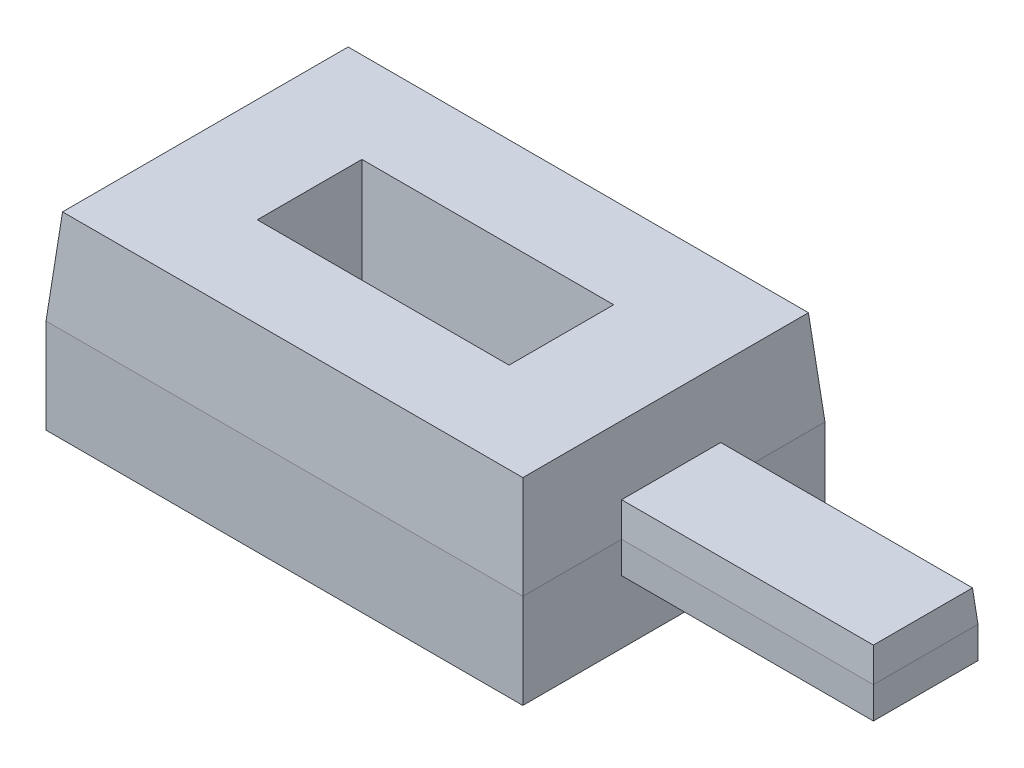
ISO-10303-21;
HEADER;
FILE_DESCRIPTION(('STEP AP214'),'2;1');
FILE_NAME('part.step','',(''),(''),'','','');
FILE_SCHEMA(('AUTOMOTIVE_DESIGN { 1 0 10303 214 1 1 1 1 }'));
ENDSEC;
DATA;
#1=APPLICATION_CONTEXT('core data for automotive mechanical design processes');
#2=APPLICATION_PROTOCOL_DEFINITION('international standard','automotive_design',2000,#1);
#3=PRODUCT_CONTEXT('',#1,'mechanical');
#4=PRODUCT('Part','Part','',(#3));
#5=PRODUCT_RELATED_PRODUCT_CATEGORY('part','',(#4));
#6=PRODUCT_DEFINITION_FORMATION('','',#4);
#7=PRODUCT_DEFINITION_CONTEXT('part definition',#1,'design');
#8=PRODUCT_DEFINITION('design','',#6,#7);
#9=PRODUCT_DEFINITION_SHAPE('','',#8);
#10=(LENGTH_UNIT() NAMED_UNIT(*) SI_UNIT(.MILLI.,.METRE.));
#11=(NAMED_UNIT(*) PLANE_ANGLE_UNIT() SI_UNIT($,.RADIAN.));
#12=(NAMED_UNIT(*) SI_UNIT($,.STERADIAN.) SOLID_ANGLE_UNIT());
#13=UNCERTAINTY_MEASURE_WITH_UNIT(LENGTH_MEASURE(1.E-05),#10,'distance_accuracy_value','');
#14=(GEOMETRIC_REPRESENTATION_CONTEXT(3) GLOBAL_UNCERTAINTY_ASSIGNED_CONTEXT((#13)) GLOBAL_UNIT_ASSIGNED_CONTEXT((#10,
#11,#12)) REPRESENTATION_CONTEXT('',''));
#15=CARTESIAN_POINT('',(0.,0.,0.));
#16=DIRECTION('',(0.,0.,1.));
#17=DIRECTION('',(1.,0.,0.));
#18=AXIS2_PLACEMENT_3D('',#15,#16,#17);
#19=CARTESIAN_POINT('',(75.6578707325463,30.,47.9373382314693));
#20=DIRECTION('',(0.,0.,1.));
#21=DIRECTION('',(1.,0.,0.));
#22=AXIS2_PLACEMENT_3D('',#19,#20,#21);
#23=PLANE('',#22);
#24=DIRECTION('',(0.,-1.,0.));
#25=VECTOR('',#24,1.);
#26=CARTESIAN_POINT('',(75.6578707325463,30.,47.9373382314693));
#27=LINE('',#26,#25);
#28=CARTESIAN_POINT('',(75.6578707325463,0.,47.9373382314693));
#29=VERTEX_POINT('',#28);
#30=CARTESIAN_POINT('',(75.6578707325463,-30.,47.9373382314693));
#31=VERTEX_POINT('',#30);
#32=EDGE_CURVE('E195',#29,#31,#27,.T.);
#33=ORIENTED_EDGE('',*,*,#32,.F.);
#34=DIRECTION('',(-1.,0.,0.));
#35=VECTOR('',#34,1.);
#36=CARTESIAN_POINT('',(75.6578707325463,0.,47.9373382314693));
#37=LINE('',#36,#35);
#38=CARTESIAN_POINT('',(-75.6578707325463,0.,47.9373382314693));
#39=VERTEX_POINT('',#38);
#40=EDGE_CURVE('E11',#29,#39,#37,.T.);
#41=ORIENTED_EDGE('',*,*,#40,.T.);
#42=DIRECTION('',(0.,-1.,0.));
#43=VECTOR('',#42,1.);
#44=CARTESIAN_POINT('',(-75.6578707325463,30.,47.9373382314693));
#45=LINE('',#44,#43);
#46=CARTESIAN_POINT('',(-75.6578707325463,-30.,47.9373382314693));
#47=VERTEX_POINT('',#46);
#48=EDGE_CURVE('E173',#39,#47,#45,.T.);
#49=ORIENTED_EDGE('',*,*,#48,.T.);
#50=DIRECTION('',(-1.,0.,0.));
#51=VECTOR('',#50,1.);
#52=CARTESIAN_POINT('',(75.6578707325463,-30.,47.9373382314693));
#53=LINE('',#52,#51);
#54=EDGE_CURVE('E251',#31,#47,#53,.T.);
#55=ORIENTED_EDGE('',*,*,#54,.F.);
#56=EDGE_LOOP('',(#33,#41,#49,#55));
#57=FACE_BOUND('',#56,.T.);
#58=ADVANCED_FACE('F39',(#57),#23,.T.);
#59=CARTESIAN_POINT('',(155.555431519054,10.,16.5988079920003));
#60=DIRECTION('',(0.,0.,-1.));
#61=DIRECTION('',(-1.,0.,0.));
#62=AXIS2_PLACEMENT_3D('',#59,#60,#61);
#63=PLANE('',#62);
#64=DIRECTION('',(1.,0.,0.));
#65=VECTOR('',#64,1.);
#66=CARTESIAN_POINT('',(155.555431519054,0.,16.5988079920003));
#67=LINE('',#66,#65);
#68=CARTESIAN_POINT('',(75.6578707325463,0.,16.5988079920003));
#69=VERTEX_POINT('',#68);
#70=CARTESIAN_POINT('',(155.555431519054,0.,16.5988079920003));
#71=VERTEX_POINT('',#70);
#72=EDGE_CURVE('E50',#69,#71,#67,.T.);
#73=ORIENTED_EDGE('',*,*,#72,.F.);
#74=DIRECTION('',(0.,-1.,0.));
#75=VECTOR('',#74,1.);
#76=CARTESIAN_POINT('',(75.6578707325463,10.,16.5988079920003));
#77=LINE('',#76,#75);
#78=CARTESIAN_POINT('',(75.6578707325463,-10.,16.5988079920003));
#79=VERTEX_POINT('',#78);
#80=EDGE_CURVE('E203',#69,#79,#77,.T.);
#81=ORIENTED_EDGE('',*,*,#80,.T.);
#82=DIRECTION('',(1.,0.,0.));
#83=VECTOR('',#82,1.);
#84=CARTESIAN_POINT('',(155.555431519054,-10.,16.5988079920003));
#85=LINE('',#84,#83);
#86=CARTESIAN_POINT('',(155.555431519054,-10.,16.5988079920003));
#87=VERTEX_POINT('',#86);
#88=EDGE_CURVE('E229',#79,#87,#85,.T.);
#89=ORIENTED_EDGE('',*,*,#88,.T.);
#90=DIRECTION('',(0.,-1.,0.));
#91=VECTOR('',#90,1.);
#92=CARTESIAN_POINT('',(155.555431519054,10.,16.5988079920003));
#93=LINE('',#92,#91);
#94=EDGE_CURVE('E99',#71,#87,#93,.T.);
#95=ORIENTED_EDGE('',*,*,#94,.F.);
#96=EDGE_LOOP('',(#73,#81,#89,#95));
#97=FACE_BOUND('',#96,.T.);
#98=ADVANCED_FACE('F317',(#97),#63,.F.);
#99=CARTESIAN_POINT('',(155.555431519054,10.,16.5988079920003));
#100=DIRECTION('',(-1.,0.,0.));
#101=DIRECTION('',(0.,0.,1.));
#102=AXIS2_PLACEMENT_3D('',#99,#100,#101);
#103=PLANE('',#102);
#104=DIRECTION('',(0.,0.,-1.));
#105=VECTOR('',#104,1.);
#106=CARTESIAN_POINT('',(155.555431519054,0.,16.5988079920003));
#107=LINE('',#106,#105);
#108=CARTESIAN_POINT('',(155.555431519054,0.,-16.5988079920003));
#109=VERTEX_POINT('',#108);
#110=EDGE_CURVE('E287',#71,#109,#107,.T.);
#111=ORIENTED_EDGE('',*,*,#110,.F.);
#112=ORIENTED_EDGE('',*,*,#94,.T.);
#113=DIRECTION('',(0.,0.,-1.));
#114=VECTOR('',#113,1.);
#115=CARTESIAN_POINT('',(155.555431519054,-10.,16.5988079920003));
#116=LINE('',#115,#114);
#117=CARTESIAN_POINT('',(155.555431519054,-10.,-16.5988079920003));
#118=VERTEX_POINT('',#117);
#119=EDGE_CURVE('E272',#87,#118,#116,.T.);
#120=ORIENTED_EDGE('',*,*,#119,.T.);
#121=DIRECTION('',(0.,-1.,0.));
#122=VECTOR('',#121,1.);
#123=CARTESIAN_POINT('',(155.555431519054,10.,-16.5988079920003));
#124=LINE('',#123,#122);
#125=EDGE_CURVE('E207',#109,#118,#124,.T.);
#126=ORIENTED_EDGE('',*,*,#125,.F.);
#127=EDGE_LOOP('',(#111,#112,#120,#126));
#128=FACE_BOUND('',#127,.T.);
#129=ADVANCED_FACE('F316',(#128),#103,.F.);
#130=CARTESIAN_POINT('',(155.555431519054,10.,-16.5988079920003));
#131=DIRECTION('',(0.,0.,1.));
#132=DIRECTION('',(1.,0.,0.));
#133=AXIS2_PLACEMENT_3D('',#130,#131,#132);
#134=PLANE('',#133);
#135=DIRECTION('',(-1.,0.,0.));
#136=VECTOR('',#135,1.);
#137=CARTESIAN_POINT('',(155.555431519054,0.,-16.5988079920003));
#138=LINE('',#137,#136);
#139=CARTESIAN_POINT('',(75.6578707325463,0.,-16.5988079920003));
#140=VERTEX_POINT('',#139);
#141=EDGE_CURVE('E163',#109,#140,#138,.T.);
#142=ORIENTED_EDGE('',*,*,#141,.F.);
#143=ORIENTED_EDGE('',*,*,#125,.T.);
#144=DIRECTION('',(-1.,0.,0.));
#145=VECTOR('',#144,1.);
#146=CARTESIAN_POINT('',(155.555431519054,-10.,-16.5988079920003));
#147=LINE('',#146,#145);
#148=CARTESIAN_POINT('',(75.6578707325463,-10.,-16.5988079920003));
#149=VERTEX_POINT('',#148);
#150=EDGE_CURVE('E239',#118,#149,#147,.T.);
#151=ORIENTED_EDGE('',*,*,#150,.T.);
#152=DIRECTION('',(0.,-1.,0.));
#153=VECTOR('',#152,1.);
#154=CARTESIAN_POINT('',(75.6578707325463,10.,-16.5988079920003));
#155=LINE('',#154,#153);
#156=EDGE_CURVE('E202',#140,#149,#155,.T.);
#157=ORIENTED_EDGE('',*,*,#156,.F.);
#158=EDGE_LOOP('',(#142,#143,#151,#157));
#159=FACE_BOUND('',#158,.T.);
#160=ADVANCED_FACE('F307',(#159),#134,.F.);
#161=CARTESIAN_POINT('',(75.6578707325463,30.,-47.9373382314693));
#162=DIRECTION('',(0.,0.,1.));
#163=DIRECTION('',(1.,0.,0.));
#164=AXIS2_PLACEMENT_3D('',#161,#162,#163);
#165=PLANE('',#164);
#166=DIRECTION('',(-1.,0.,0.));
#167=VECTOR('',#166,1.);
#168=CARTESIAN_POINT('',(75.6578707325463,0.,-47.9373382314693));
#169=LINE('',#168,#167);
#170=CARTESIAN_POINT('',(75.6578707325463,0.,-47.9373382314693));
#171=VERTEX_POINT('',#170);
#172=CARTESIAN_POINT('',(-75.6578707325463,0.,-47.9373382314693));
#173=VERTEX_POINT('',#172);
#174=EDGE_CURVE('E150',#171,#173,#169,.T.);
#175=ORIENTED_EDGE('',*,*,#174,.F.);
#176=DIRECTION('',(0.,-1.,0.));
#177=VECTOR('',#176,1.);
#178=CARTESIAN_POINT('',(75.6578707325463,30.,-47.9373382314693));
#179=LINE('',#178,#177);
#180=CARTESIAN_POINT('',(75.6578707325463,-30.,-47.9373382314693));
#181=VERTEX_POINT('',#180);
#182=EDGE_CURVE('E196',#171,#181,#179,.T.);
#183=ORIENTED_EDGE('',*,*,#182,.T.);
#184=DIRECTION('',(-1.,0.,0.));
#185=VECTOR('',#184,1.);
#186=CARTESIAN_POINT('',(75.6578707325463,-30.,-47.9373382314693));
#187=LINE('',#186,#185);
#188=CARTESIAN_POINT('',(-75.6578707325463,-30.,-47.9373382314693));
#189=VERTEX_POINT('',#188);
#190=EDGE_CURVE('E181',#181,#189,#187,.T.);
#191=ORIENTED_EDGE('',*,*,#190,.T.);
#192=DIRECTION('',(0.,-1.,0.));
#193=VECTOR('',#192,1.);
#194=CARTESIAN_POINT('',(-75.6578707325463,30.,-47.9373382314693));
#195=LINE('',#194,#193);
#196=EDGE_CURVE('E171',#173,#189,#195,.T.);
#197=ORIENTED_EDGE('',*,*,#196,.F.);
#198=EDGE_LOOP('',(#175,#183,#191,#197));
#199=FACE_BOUND('',#198,.T.);
#200=ADVANCED_FACE('F179',(#199),#165,.F.);
#201=CARTESIAN_POINT('',(-75.6578707325463,30.,47.9373382314693));
#202=DIRECTION('',(-1.,0.,0.));
#203=DIRECTION('',(0.,0.,1.));
#204=AXIS2_PLACEMENT_3D('',#201,#202,#203);
#205=PLANE('',#204);
#206=ORIENTED_EDGE('',*,*,#48,.F.);
#207=DIRECTION('',(0.,0.,-1.));
#208=VECTOR('',#207,1.);
#209=CARTESIAN_POINT('',(-75.6578707325463,0.,47.9373382314693));
#210=LINE('',#209,#208);
#211=EDGE_CURVE('E164',#39,#173,#210,.T.);
#212=ORIENTED_EDGE('',*,*,#211,.T.);
#213=ORIENTED_EDGE('',*,*,#196,.T.);
#214=DIRECTION('',(0.,0.,-1.));
#215=VECTOR('',#214,1.);
#216=CARTESIAN_POINT('',(-75.6578707325463,-30.,47.9373382314693));
#217=LINE('',#216,#215);
#218=EDGE_CURVE('E249',#47,#189,#217,.T.);
#219=ORIENTED_EDGE('',*,*,#218,.F.);
#220=EDGE_LOOP('',(#206,#212,#213,#219));
#221=FACE_BOUND('',#220,.T.);
#222=ADVANCED_FACE('F169',(#221),#205,.T.);
#223=CARTESIAN_POINT('',(75.6578707325463,30.,47.9373382314693));
#224=DIRECTION('',(-1.,0.,0.));
#225=DIRECTION('',(0.,0.,1.));
#226=AXIS2_PLACEMENT_3D('',#223,#224,#225);
#227=PLANE('',#226);
#228=DIRECTION('',(0.,0.,1.));
#229=VECTOR('',#228,1.);
#230=CARTESIAN_POINT('',(75.6578707325463,0.,47.9373382314693));
#231=LINE('',#230,#229);
#232=EDGE_CURVE('E177',#29,#69,#231,.F.);
#233=ORIENTED_EDGE('',*,*,#232,.F.);
#234=ORIENTED_EDGE('',*,*,#32,.T.);
#235=DIRECTION('',(0.,0.,-1.));
#236=VECTOR('',#235,1.);
#237=CARTESIAN_POINT('',(75.6578707325463,-30.,47.9373382314693));
#238=LINE('',#237,#236);
#239=EDGE_CURVE('E224',#31,#181,#238,.T.);
#240=ORIENTED_EDGE('',*,*,#239,.T.);
#241=ORIENTED_EDGE('',*,*,#182,.F.);
#242=DIRECTION('',(0.,0.,-1.));
#243=VECTOR('',#242,1.);
#244=CARTESIAN_POINT('',(75.6578707325463,0.,47.9373382314693));
#245=LINE('',#244,#243);
#246=EDGE_CURVE('E188',#140,#171,#245,.T.);
#247=ORIENTED_EDGE('',*,*,#246,.F.);
#248=ORIENTED_EDGE('',*,*,#156,.T.);
#249=DIRECTION('',(0.,0.,1.));
#250=VECTOR('',#249,1.);
#251=CARTESIAN_POINT('',(75.6578707325463,-10.,16.5988079920003));
#252=LINE('',#251,#250);
#253=EDGE_CURVE('E233',#149,#79,#252,.T.);
#254=ORIENTED_EDGE('',*,*,#253,.T.);
#255=ORIENTED_EDGE('',*,*,#80,.F.);
#256=EDGE_LOOP('',(#233,#234,#240,#241,#247,#248,#254,#255));
#257=FACE_BOUND('',#256,.T.);
#258=ADVANCED_FACE('F303',(#257),#227,.F.);
#259=CARTESIAN_POINT('',(75.6578707325463,0.,-47.9373382314693));
#260=DIRECTION('',(0.,0.0871557427476582,-0.996194698091746));
#261=DIRECTION('',(0.,0.996194698091746,0.0871557427476582));
#262=AXIS2_PLACEMENT_3D('',#259,#260,#261);
#263=PLANE('',#262);
#264=DIRECTION('',(0.0868265938642476,-0.992432509138967,-0.0868265938642476));
#265=VECTOR('',#264,1.);
#266=CARTESIAN_POINT('',(75.6578707325463,0.,-47.9373382314693));
#267=LINE('',#266,#265);
#268=CARTESIAN_POINT('',(73.0332108267686,30.,-45.3126783256916));
#269=VERTEX_POINT('',#268);
#270=EDGE_CURVE('E158',#269,#171,#267,.T.);
#271=ORIENTED_EDGE('',*,*,#270,.T.);
#272=ORIENTED_EDGE('',*,*,#174,.T.);
#273=DIRECTION('',(0.0868265938642476,0.992432509138967,0.0868265938642476));
#274=VECTOR('',#273,1.);
#275=CARTESIAN_POINT('',(-74.517122934953,13.038806990752,-46.7965904338759));
#276=LINE('',#275,#274);
#277=CARTESIAN_POINT('',(-73.0332108267686,30.,-45.3126783256916));
#278=VERTEX_POINT('',#277);
#279=EDGE_CURVE('E155',#278,#173,#276,.F.);
#280=ORIENTED_EDGE('',*,*,#279,.F.);
#281=DIRECTION('',(1.,0.,0.));
#282=VECTOR('',#281,1.);
#283=CARTESIAN_POINT('',(0.,30.,-45.3126783256916));
#284=LINE('',#283,#282);
#285=EDGE_CURVE('E218',#269,#278,#284,.F.);
#286=ORIENTED_EDGE('',*,*,#285,.F.);
#287=EDGE_LOOP('',(#271,#272,#280,#286));
#288=FACE_BOUND('',#287,.T.);
#289=ADVANCED_FACE('F152',(#288),#263,.T.);
#290=CARTESIAN_POINT('',(-75.6578707325463,0.,47.9373382314693));
#291=DIRECTION('',(-0.996194698091746,0.0871557427476582,0.));
#292=DIRECTION('',(-0.0871557427476582,-0.996194698091746,0.));
#293=AXIS2_PLACEMENT_3D('',#290,#291,#292);
#294=PLANE('',#293);
#295=ORIENTED_EDGE('',*,*,#211,.F.);
#296=DIRECTION('',(-0.0868265938642476,-0.992432509138967,0.0868265938642476));
#297=VECTOR('',#296,1.);
#298=CARTESIAN_POINT('',(-74.517122934953,13.038806990752,46.7965904338759));
#299=LINE('',#298,#297);
#300=CARTESIAN_POINT('',(-73.0332108267686,30.,45.3126783256916));
#301=VERTEX_POINT('',#300);
#302=EDGE_CURVE('E183',#301,#39,#299,.T.);
#303=ORIENTED_EDGE('',*,*,#302,.F.);
#304=DIRECTION('',(0.,0.,-1.));
#305=VECTOR('',#304,1.);
#306=CARTESIAN_POINT('',(-73.0332108267686,30.,0.));
#307=LINE('',#306,#305);
#308=EDGE_CURVE('E187',#301,#278,#307,.T.);
#309=ORIENTED_EDGE('',*,*,#308,.T.);
#310=ORIENTED_EDGE('',*,*,#279,.T.);
#311=EDGE_LOOP('',(#295,#303,#309,#310));
#312=FACE_BOUND('',#311,.T.);
#313=ADVANCED_FACE('F185',(#312),#294,.T.);
#314=CARTESIAN_POINT('',(75.6578707325463,0.,47.9373382314693));
#315=DIRECTION('',(0.,0.0871557427476582,0.996194698091746));
#316=DIRECTION('',(0.,-0.996194698091746,0.0871557427476582));
#317=AXIS2_PLACEMENT_3D('',#314,#315,#316);
#318=PLANE('',#317);
#319=ORIENTED_EDGE('',*,*,#40,.F.);
#320=DIRECTION('',(-0.0868265938642476,0.992432509138967,-0.0868265938642476));
#321=VECTOR('',#320,1.);
#322=CARTESIAN_POINT('',(75.6578707325463,0.,47.9373382314693));
#323=LINE('',#322,#321);
#324=CARTESIAN_POINT('',(73.0332108267686,30.,45.3126783256916));
#325=VERTEX_POINT('',#324);
#326=EDGE_CURVE('E197',#325,#29,#323,.F.);
#327=ORIENTED_EDGE('',*,*,#326,.F.);
#328=DIRECTION('',(-1.,0.,0.));
#329=VECTOR('',#328,1.);
#330=CARTESIAN_POINT('',(0.,30.,45.3126783256916));
#331=LINE('',#330,#329);
#332=EDGE_CURVE('E217',#325,#301,#331,.T.);
#333=ORIENTED_EDGE('',*,*,#332,.T.);
#334=ORIENTED_EDGE('',*,*,#302,.T.);
#335=EDGE_LOOP('',(#319,#327,#333,#334));
#336=FACE_BOUND('',#335,.T.);
#337=ADVANCED_FACE('F41',(#336),#318,.T.);
#338=CARTESIAN_POINT('',(75.6578707325463,0.,47.9373382314693));
#339=DIRECTION('',(0.996194698091746,0.0871557427476582,0.));
#340=DIRECTION('',(-0.0871557427476582,0.996194698091746,0.));
#341=AXIS2_PLACEMENT_3D('',#338,#339,#340);
#342=PLANE('',#341);
#343=ORIENTED_EDGE('',*,*,#326,.T.);
#344=ORIENTED_EDGE('',*,*,#232,.T.);
#345=DIRECTION('',(0.0868265938642476,-0.992432509138967,0.0868265938642476));
#346=VECTOR('',#345,1.);
#347=CARTESIAN_POINT('',(75.8941274432121,-2.70042655978755,16.8350647026661));
#348=LINE('',#347,#346);
#349=CARTESIAN_POINT('',(74.7829840972871,10.,15.7239213567411));
#350=VERTEX_POINT('',#349);
#351=EDGE_CURVE('E200',#350,#69,#348,.T.);
#352=ORIENTED_EDGE('',*,*,#351,.F.);
#353=DIRECTION('',(0.,0.,-1.));
#354=VECTOR('',#353,1.);
#355=CARTESIAN_POINT('',(74.7829840972871,10.,0.));
#356=LINE('',#355,#354);
#357=CARTESIAN_POINT('',(74.7829840972871,10.,-15.7239213567411));
#358=VERTEX_POINT('',#357);
#359=EDGE_CURVE('E225',#358,#350,#356,.F.);
#360=ORIENTED_EDGE('',*,*,#359,.F.);
#361=DIRECTION('',(0.0868265938642476,-0.992432509138967,-0.0868265938642476));
#362=VECTOR('',#361,1.);
#363=CARTESIAN_POINT('',(76.2602070500888,-6.88473561336298,-17.2011443095428));
#364=LINE('',#363,#362);
#365=EDGE_CURVE('E204',#358,#140,#364,.T.);
#366=ORIENTED_EDGE('',*,*,#365,.T.);
#367=ORIENTED_EDGE('',*,*,#246,.T.);
#368=ORIENTED_EDGE('',*,*,#270,.F.);
#369=DIRECTION('',(0.,0.,1.));
#370=VECTOR('',#369,1.);
#371=CARTESIAN_POINT('',(73.0332108267686,30.,0.));
#372=LINE('',#371,#370);
#373=EDGE_CURVE('E221',#325,#269,#372,.F.);
#374=ORIENTED_EDGE('',*,*,#373,.F.);
#375=EDGE_LOOP('',(#343,#344,#352,#360,#366,#367,#368,#374));
#376=FACE_BOUND('',#375,.T.);
#377=ADVANCED_FACE('F309',(#376),#342,.T.);
#378=CARTESIAN_POINT('',(0.,30.,0.));
#379=DIRECTION('',(0.,-1.,0.));
#380=DIRECTION('',(0.,0.,-1.));
#381=AXIS2_PLACEMENT_3D('',#378,#379,#380);
#382=PLANE('',#381);
#383=DIRECTION('',(1.,0.,0.));
#384=VECTOR('',#383,1.);
#385=CARTESIAN_POINT('',(39.9487803932537,30.,16.5988079920003));
#386=LINE('',#385,#384);
#387=CARTESIAN_POINT('',(-39.9487803932537,30.,16.5988079920003));
#388=VERTEX_POINT('',#387);
#389=CARTESIAN_POINT('',(39.9487803932537,30.,16.5988079920003));
#390=VERTEX_POINT('',#389);
#391=EDGE_CURVE('E330',#388,#390,#386,.T.);
#392=ORIENTED_EDGE('',*,*,#391,.F.);
#393=DIRECTION('',(0.,0.,1.));
#394=VECTOR('',#393,1.);
#395=CARTESIAN_POINT('',(-39.9487803932537,30.,16.5988079920003));
#396=LINE('',#395,#394);
#397=CARTESIAN_POINT('',(-39.9487803932537,30.,-16.5988079920003));
#398=VERTEX_POINT('',#397);
#399=EDGE_CURVE('E333',#398,#388,#396,.T.);
#400=ORIENTED_EDGE('',*,*,#399,.F.);
#401=DIRECTION('',(-1.,0.,0.));
#402=VECTOR('',#401,1.);
#403=CARTESIAN_POINT('',(39.9487803932537,30.,-16.5988079920003));
#404=LINE('',#403,#402);
#405=CARTESIAN_POINT('',(39.9487803932537,30.,-16.5988079920003));
#406=VERTEX_POINT('',#405);
#407=EDGE_CURVE('E283',#406,#398,#404,.T.);
#408=ORIENTED_EDGE('',*,*,#407,.F.);
#409=DIRECTION('',(0.,0.,-1.));
#410=VECTOR('',#409,1.);
#411=CARTESIAN_POINT('',(39.9487803932537,30.,16.5988079920003));
#412=LINE('',#411,#410);
#413=EDGE_CURVE('E327',#390,#406,#412,.T.);
#414=ORIENTED_EDGE('',*,*,#413,.F.);
#415=EDGE_LOOP('',(#392,#400,#408,#414));
#416=FACE_BOUND('',#415,.T.);
#417=ORIENTED_EDGE('',*,*,#285,.T.);
#418=ORIENTED_EDGE('',*,*,#308,.F.);
#419=ORIENTED_EDGE('',*,*,#332,.F.);
#420=ORIENTED_EDGE('',*,*,#373,.T.);
#421=EDGE_LOOP('',(#417,#418,#419,#420));
#422=FACE_BOUND('',#421,.T.);
#423=ADVANCED_FACE('F346',(#416,#422),#382,.F.);
#424=CARTESIAN_POINT('',(0.,-30.,0.));
#425=DIRECTION('',(0.,-1.,0.));
#426=DIRECTION('',(0.,0.,-1.));
#427=AXIS2_PLACEMENT_3D('',#424,#425,#426);
#428=PLANE('',#427);
#429=ORIENTED_EDGE('',*,*,#190,.F.);
#430=ORIENTED_EDGE('',*,*,#239,.F.);
#431=ORIENTED_EDGE('',*,*,#54,.T.);
#432=ORIENTED_EDGE('',*,*,#218,.T.);
#433=EDGE_LOOP('',(#429,#430,#431,#432));
#434=FACE_BOUND('',#433,.T.);
#435=ADVANCED_FACE('F396',(#434),#428,.T.);
#436=CARTESIAN_POINT('',(155.555431519054,0.,16.5988079920003));
#437=DIRECTION('',(0.996194698091746,0.0871557427476582,0.));
#438=DIRECTION('',(-0.0871557427476582,0.996194698091746,0.));
#439=AXIS2_PLACEMENT_3D('',#436,#437,#438);
#440=PLANE('',#439);
#441=DIRECTION('',(0.0868265938642476,-0.992432509138967,0.0868265938642476));
#442=VECTOR('',#441,1.);
#443=CARTESIAN_POINT('',(155.555431519054,0.,16.5988079920003));
#444=LINE('',#443,#442);
#445=CARTESIAN_POINT('',(154.680544883794,10.,15.7239213567411));
#446=VERTEX_POINT('',#445);
#447=EDGE_CURVE('E210',#446,#71,#444,.T.);
#448=ORIENTED_EDGE('',*,*,#447,.T.);
#449=ORIENTED_EDGE('',*,*,#110,.T.);
#450=DIRECTION('',(0.0868265938642476,-0.992432509138967,-0.0868265938642476));
#451=VECTOR('',#450,1.);
#452=CARTESIAN_POINT('',(155.555431519054,0.,-16.5988079920003));
#453=LINE('',#452,#451);
#454=CARTESIAN_POINT('',(154.680544883794,10.,-15.7239213567411));
#455=VERTEX_POINT('',#454);
#456=EDGE_CURVE('E208',#455,#109,#453,.T.);
#457=ORIENTED_EDGE('',*,*,#456,.F.);
#458=DIRECTION('',(0.,0.,1.));
#459=VECTOR('',#458,1.);
#460=CARTESIAN_POINT('',(154.680544883794,10.,16.5988079920003));
#461=LINE('',#460,#459);
#462=EDGE_CURVE('E228',#446,#455,#461,.F.);
#463=ORIENTED_EDGE('',*,*,#462,.F.);
#464=EDGE_LOOP('',(#448,#449,#457,#463));
#465=FACE_BOUND('',#464,.T.);
#466=ADVANCED_FACE('F315',(#465),#440,.T.);
#467=CARTESIAN_POINT('',(155.555431519054,0.,-16.5988079920003));
#468=DIRECTION('',(0.,0.0871557427476582,-0.996194698091746));
#469=DIRECTION('',(0.,0.996194698091746,0.0871557427476582));
#470=AXIS2_PLACEMENT_3D('',#467,#468,#469);
#471=PLANE('',#470);
#472=ORIENTED_EDGE('',*,*,#456,.T.);
#473=ORIENTED_EDGE('',*,*,#141,.T.);
#474=ORIENTED_EDGE('',*,*,#365,.F.);
#475=DIRECTION('',(1.,0.,0.));
#476=VECTOR('',#475,1.);
#477=CARTESIAN_POINT('',(155.555431519054,10.,-15.7239213567411));
#478=LINE('',#477,#476);
#479=EDGE_CURVE('E43',#455,#358,#478,.F.);
#480=ORIENTED_EDGE('',*,*,#479,.F.);
#481=EDGE_LOOP('',(#472,#473,#474,#480));
#482=FACE_BOUND('',#481,.T.);
#483=ADVANCED_FACE('F295',(#482),#471,.T.);
#484=CARTESIAN_POINT('',(155.555431519054,0.,16.5988079920003));
#485=DIRECTION('',(0.,0.0871557427476582,0.996194698091746));
#486=DIRECTION('',(0.,-0.996194698091746,0.0871557427476582));
#487=AXIS2_PLACEMENT_3D('',#484,#485,#486);
#488=PLANE('',#487);
#489=ORIENTED_EDGE('',*,*,#351,.T.);
#490=ORIENTED_EDGE('',*,*,#72,.T.);
#491=ORIENTED_EDGE('',*,*,#447,.F.);
#492=DIRECTION('',(-1.,0.,0.));
#493=VECTOR('',#492,1.);
#494=CARTESIAN_POINT('',(155.555431519054,10.,15.7239213567411));
#495=LINE('',#494,#493);
#496=EDGE_CURVE('E227',#350,#446,#495,.F.);
#497=ORIENTED_EDGE('',*,*,#496,.F.);
#498=EDGE_LOOP('',(#489,#490,#491,#497));
#499=FACE_BOUND('',#498,.T.);
#500=ADVANCED_FACE('F313',(#499),#488,.T.);
#501=CARTESIAN_POINT('',(0.,10.,0.));
#502=DIRECTION('',(0.,1.,0.));
#503=DIRECTION('',(0.,0.,1.));
#504=AXIS2_PLACEMENT_3D('',#501,#502,#503);
#505=PLANE('',#504);
#506=ORIENTED_EDGE('',*,*,#462,.T.);
#507=ORIENTED_EDGE('',*,*,#479,.T.);
#508=ORIENTED_EDGE('',*,*,#359,.T.);
#509=ORIENTED_EDGE('',*,*,#496,.T.);
#510=EDGE_LOOP('',(#506,#507,#508,#509));
#511=FACE_BOUND('',#510,.T.);
#512=ADVANCED_FACE('F312',(#511),#505,.T.);
#513=CARTESIAN_POINT('',(0.,-10.,0.));
#514=DIRECTION('',(0.,1.,0.));
#515=DIRECTION('',(0.,0.,1.));
#516=AXIS2_PLACEMENT_3D('',#513,#514,#515);
#517=PLANE('',#516);
#518=ORIENTED_EDGE('',*,*,#119,.F.);
#519=ORIENTED_EDGE('',*,*,#88,.F.);
#520=ORIENTED_EDGE('',*,*,#253,.F.);
#521=ORIENTED_EDGE('',*,*,#150,.F.);
#522=EDGE_LOOP('',(#518,#519,#520,#521));
#523=FACE_BOUND('',#522,.T.);
#524=ADVANCED_FACE('F322',(#523),#517,.F.);
#525=CARTESIAN_POINT('',(-39.9487803932537,30.,16.5988079920003));
#526=DIRECTION('',(0.998629534754574,0.0523359562429439,0.));
#527=DIRECTION('',(-0.052335956242944,0.998629534754574,0.));
#528=AXIS2_PLACEMENT_3D('',#525,#526,#527);
#529=PLANE('',#528);
#530=ORIENTED_EDGE('',*,*,#399,.T.);
#531=DIRECTION('',(-0.052264427688714,0.997264688634237,0.0522644276887141));
#532=VECTOR('',#531,1.);
#533=CARTESIAN_POINT('',(-39.9487803932537,30.,16.5988079920003));
#534=LINE('',#533,#532);
#535=CARTESIAN_POINT('',(-37.852469221932,-10.,14.5024968206787));
#536=VERTEX_POINT('',#535);
#537=EDGE_CURVE('E263',#536,#388,#534,.T.);
#538=ORIENTED_EDGE('',*,*,#537,.F.);
#539=DIRECTION('',(0.,0.,-1.));
#540=VECTOR('',#539,1.);
#541=CARTESIAN_POINT('',(-37.852469221932,-10.,0.));
#542=LINE('',#541,#540);
#543=CARTESIAN_POINT('',(-37.852469221932,-10.,-14.5024968206787));
#544=VERTEX_POINT('',#543);
#545=EDGE_CURVE('E277',#544,#536,#542,.F.);
#546=ORIENTED_EDGE('',*,*,#545,.F.);
#547=DIRECTION('',(-0.052264427688714,0.997264688634237,-0.052264427688714));
#548=VECTOR('',#547,1.);
#549=CARTESIAN_POINT('',(-39.7305345810469,25.8356218257585,-16.3805621797936));
#550=LINE('',#549,#548);
#551=EDGE_CURVE('E269',#544,#398,#550,.T.);
#552=ORIENTED_EDGE('',*,*,#551,.T.);
#553=EDGE_LOOP('',(#530,#538,#546,#552));
#554=FACE_BOUND('',#553,.T.);
#555=ADVANCED_FACE('F336',(#554),#529,.T.);
#556=CARTESIAN_POINT('',(39.9487803932537,30.,-16.5988079920003));
#557=DIRECTION('',(0.,0.0523359562429439,0.998629534754574));
#558=DIRECTION('',(0.,-0.998629534754574,0.052335956242944));
#559=AXIS2_PLACEMENT_3D('',#556,#557,#558);
#560=PLANE('',#559);
#561=ORIENTED_EDGE('',*,*,#407,.T.);
#562=ORIENTED_EDGE('',*,*,#551,.F.);
#563=DIRECTION('',(1.,0.,0.));
#564=VECTOR('',#563,1.);
#565=CARTESIAN_POINT('',(0.,-10.,-14.5024968206787));
#566=LINE('',#565,#564);
#567=CARTESIAN_POINT('',(37.852469221932,-10.,-14.5024968206787));
#568=VERTEX_POINT('',#567);
#569=EDGE_CURVE('E266',#568,#544,#566,.F.);
#570=ORIENTED_EDGE('',*,*,#569,.F.);
#571=DIRECTION('',(0.052264427688714,0.997264688634237,-0.0522644276887141));
#572=VECTOR('',#571,1.);
#573=CARTESIAN_POINT('',(39.8580987680272,28.2696915139871,-16.5081263667738));
#574=LINE('',#573,#572);
#575=EDGE_CURVE('E262',#568,#406,#574,.T.);
#576=ORIENTED_EDGE('',*,*,#575,.T.);
#577=EDGE_LOOP('',(#561,#562,#570,#576));
#578=FACE_BOUND('',#577,.T.);
#579=ADVANCED_FACE('F357',(#578),#560,.T.);
#580=CARTESIAN_POINT('',(39.9487803932537,30.,16.5988079920003));
#581=DIRECTION('',(-0.998629534754574,0.0523359562429439,0.));
#582=DIRECTION('',(-0.052335956242944,-0.998629534754574,0.));
#583=AXIS2_PLACEMENT_3D('',#580,#581,#582);
#584=PLANE('',#583);
#585=ORIENTED_EDGE('',*,*,#413,.T.);
#586=ORIENTED_EDGE('',*,*,#575,.F.);
#587=DIRECTION('',(0.,0.,1.));
#588=VECTOR('',#587,1.);
#589=CARTESIAN_POINT('',(37.852469221932,-10.,0.));
#590=LINE('',#589,#588);
#591=CARTESIAN_POINT('',(37.852469221932,-10.,14.5024968206787));
#592=VERTEX_POINT('',#591);
#593=EDGE_CURVE('E276',#592,#568,#590,.F.);
#594=ORIENTED_EDGE('',*,*,#593,.F.);
#595=DIRECTION('',(0.052264427688714,0.997264688634237,0.052264427688714));
#596=VECTOR('',#595,1.);
#597=CARTESIAN_POINT('',(39.9487803932537,30.,16.5988079920003));
#598=LINE('',#597,#596);
#599=EDGE_CURVE('E259',#592,#390,#598,.T.);
#600=ORIENTED_EDGE('',*,*,#599,.T.);
#601=EDGE_LOOP('',(#585,#586,#594,#600));
#602=FACE_BOUND('',#601,.T.);
#603=ADVANCED_FACE('F351',(#602),#584,.T.);
#604=CARTESIAN_POINT('',(39.9487803932537,30.,16.5988079920003));
#605=DIRECTION('',(0.,0.0523359562429439,-0.998629534754574));
#606=DIRECTION('',(0.,0.998629534754574,0.052335956242944));
#607=AXIS2_PLACEMENT_3D('',#604,#605,#606);
#608=PLANE('',#607);
#609=ORIENTED_EDGE('',*,*,#391,.T.);
#610=ORIENTED_EDGE('',*,*,#599,.F.);
#611=DIRECTION('',(-1.,0.,0.));
#612=VECTOR('',#611,1.);
#613=CARTESIAN_POINT('',(0.,-10.,14.5024968206787));
#614=LINE('',#613,#612);
#615=EDGE_CURVE('E273',#536,#592,#614,.F.);
#616=ORIENTED_EDGE('',*,*,#615,.F.);
#617=ORIENTED_EDGE('',*,*,#537,.T.);
#618=EDGE_LOOP('',(#609,#610,#616,#617));
#619=FACE_BOUND('',#618,.T.);
#620=ADVANCED_FACE('F343',(#619),#608,.T.);
#621=CARTESIAN_POINT('',(0.,-10.,0.));
#622=DIRECTION('',(0.,1.,0.));
#623=DIRECTION('',(0.,0.,1.));
#624=AXIS2_PLACEMENT_3D('',#621,#622,#623);
#625=PLANE('',#624);
#626=ORIENTED_EDGE('',*,*,#545,.T.);
#627=ORIENTED_EDGE('',*,*,#615,.T.);
#628=ORIENTED_EDGE('',*,*,#593,.T.);
#629=ORIENTED_EDGE('',*,*,#569,.T.);
#630=EDGE_LOOP('',(#626,#627,#628,#629));
#631=FACE_BOUND('',#630,.T.);
#632=ADVANCED_FACE('F359',(#631),#625,.T.);
#633=CLOSED_SHELL('',(#58,#98,#129,#160,#200,#222,#258,#289,#313,#337,#377,#423,#435,#466,#483,
#500,#512,#524,#555,#579,#603,#620,#632));
#634=MANIFOLD_SOLID_BREP('B2',#633);
#635=ADVANCED_BREP_SHAPE_REPRESENTATION('',(#18,#634),#14);
#636=SHAPE_DEFINITION_REPRESENTATION(#9,#635);
ENDSEC;
END-ISO-10303-21;
